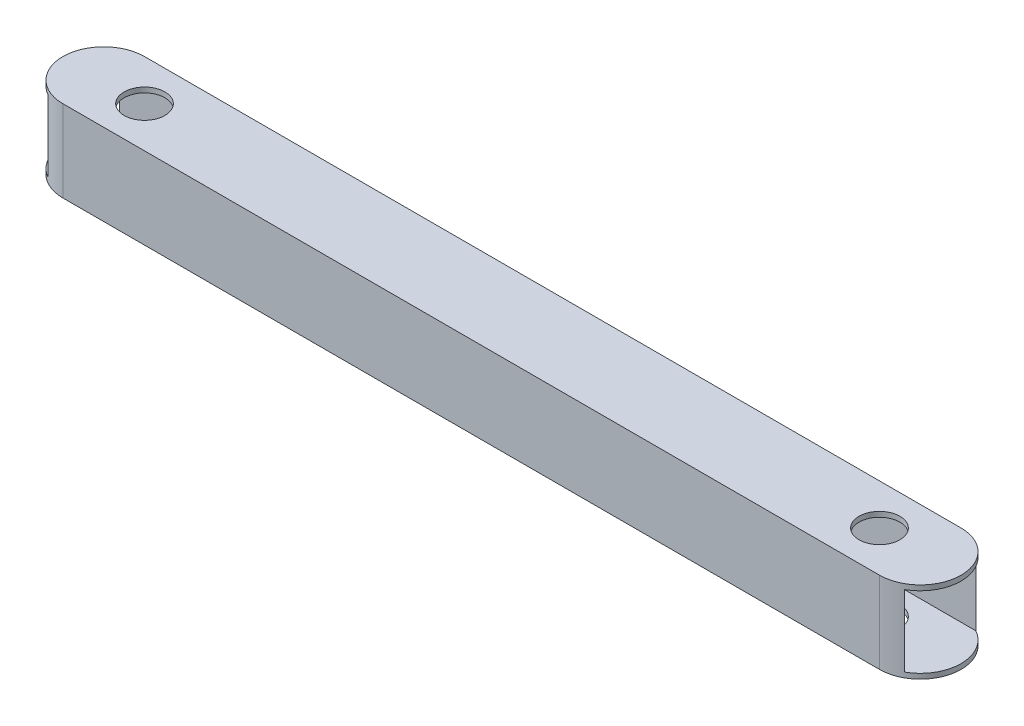
ISO-10303-21;
HEADER;
FILE_DESCRIPTION(('STEP AP214'),'2;1');
FILE_NAME('part.step','',(''),(''),'','','');
FILE_SCHEMA(('AUTOMOTIVE_DESIGN { 1 0 10303 214 1 1 1 1 }'));
ENDSEC;
DATA;
#1=APPLICATION_CONTEXT('core data for automotive mechanical design processes');
#2=APPLICATION_PROTOCOL_DEFINITION('international standard','automotive_design',2000,#1);
#3=PRODUCT_CONTEXT('',#1,'mechanical');
#4=PRODUCT('Part','Part','',(#3));
#5=PRODUCT_RELATED_PRODUCT_CATEGORY('part','',(#4));
#6=PRODUCT_DEFINITION_FORMATION('','',#4);
#7=PRODUCT_DEFINITION_CONTEXT('part definition',#1,'design');
#8=PRODUCT_DEFINITION('design','',#6,#7);
#9=PRODUCT_DEFINITION_SHAPE('','',#8);
#10=(LENGTH_UNIT() NAMED_UNIT(*) SI_UNIT(.MILLI.,.METRE.));
#11=(NAMED_UNIT(*) PLANE_ANGLE_UNIT() SI_UNIT($,.RADIAN.));
#12=(NAMED_UNIT(*) SI_UNIT($,.STERADIAN.) SOLID_ANGLE_UNIT());
#13=UNCERTAINTY_MEASURE_WITH_UNIT(LENGTH_MEASURE(1.E-05),#10,'distance_accuracy_value','');
#14=(GEOMETRIC_REPRESENTATION_CONTEXT(3) GLOBAL_UNCERTAINTY_ASSIGNED_CONTEXT((#13)) GLOBAL_UNIT_ASSIGNED_CONTEXT((#10,
#11,#12)) REPRESENTATION_CONTEXT('',''));
#15=CARTESIAN_POINT('',(0.,0.,0.));
#16=DIRECTION('',(0.,0.,1.));
#17=DIRECTION('',(1.,0.,0.));
#18=AXIS2_PLACEMENT_3D('',#15,#16,#17);
#19=CARTESIAN_POINT('',(25.4,-12.7,0.));
#20=DIRECTION('',(0.,-1.,0.));
#21=DIRECTION('',(0.,0.,-1.));
#22=AXIS2_PLACEMENT_3D('',#19,#20,#21);
#23=CYLINDRICAL_SURFACE('',#22,6.35);
#24=CARTESIAN_POINT('',(25.4,-11.1125,0.));
#25=DIRECTION('',(0.,-1.,0.));
#26=DIRECTION('',(0.,0.,-1.));
#27=AXIS2_PLACEMENT_3D('',#24,#25,#26);
#28=CIRCLE('',#27,6.35);
#29=CARTESIAN_POINT('',(25.4,-11.1125,-6.35));
#30=VERTEX_POINT('',#29);
#31=EDGE_CURVE('E115',#30,#30,#28,.T.);
#32=ORIENTED_EDGE('',*,*,#31,.F.);
#33=EDGE_LOOP('',(#32));
#34=FACE_BOUND('',#33,.T.);
#35=CARTESIAN_POINT('',(25.4,-12.7,0.));
#36=DIRECTION('',(0.,-1.,0.));
#37=DIRECTION('',(0.,0.,-1.));
#38=AXIS2_PLACEMENT_3D('',#35,#36,#37);
#39=CIRCLE('',#38,6.35);
#40=CARTESIAN_POINT('',(25.4,-12.7,-6.35));
#41=VERTEX_POINT('',#40);
#42=EDGE_CURVE('E19',#41,#41,#39,.F.);
#43=ORIENTED_EDGE('',*,*,#42,.F.);
#44=EDGE_LOOP('',(#43));
#45=FACE_BOUND('',#44,.T.);
#46=ADVANCED_FACE('F16',(#34,#45),#23,.F.);
#47=CARTESIAN_POINT('',(254.,-12.7,0.));
#48=DIRECTION('',(0.,-1.,0.));
#49=DIRECTION('',(0.,0.,-1.));
#50=AXIS2_PLACEMENT_3D('',#47,#48,#49);
#51=CYLINDRICAL_SURFACE('',#50,6.35);
#52=CARTESIAN_POINT('',(254.,-11.1125,0.));
#53=DIRECTION('',(0.,-1.,0.));
#54=DIRECTION('',(0.,0.,-1.));
#55=AXIS2_PLACEMENT_3D('',#52,#53,#54);
#56=CIRCLE('',#55,6.35);
#57=CARTESIAN_POINT('',(254.,-11.1125,-6.35));
#58=VERTEX_POINT('',#57);
#59=EDGE_CURVE('E111',#58,#58,#56,.T.);
#60=ORIENTED_EDGE('',*,*,#59,.F.);
#61=EDGE_LOOP('',(#60));
#62=FACE_BOUND('',#61,.T.);
#63=CARTESIAN_POINT('',(254.,-12.7,0.));
#64=DIRECTION('',(0.,-1.,0.));
#65=DIRECTION('',(0.,0.,-1.));
#66=AXIS2_PLACEMENT_3D('',#63,#64,#65);
#67=CIRCLE('',#66,6.35);
#68=CARTESIAN_POINT('',(254.,-12.7,-6.35));
#69=VERTEX_POINT('',#68);
#70=EDGE_CURVE('E119',#69,#69,#67,.F.);
#71=ORIENTED_EDGE('',*,*,#70,.F.);
#72=EDGE_LOOP('',(#71));
#73=FACE_BOUND('',#72,.T.);
#74=ADVANCED_FACE('F171',(#62,#73),#51,.F.);
#75=CARTESIAN_POINT('',(0.,-12.7,12.7));
#76=DIRECTION('',(0.,-1.,0.));
#77=DIRECTION('',(0.,0.,-1.));
#78=AXIS2_PLACEMENT_3D('',#75,#76,#77);
#79=PLANE('',#78);
#80=ORIENTED_EDGE('',*,*,#70,.T.);
#81=EDGE_LOOP('',(#80));
#82=FACE_BOUND('',#81,.T.);
#83=ORIENTED_EDGE('',*,*,#42,.T.);
#84=EDGE_LOOP('',(#83));
#85=FACE_BOUND('',#84,.T.);
#86=DIRECTION('',(-1.,0.,0.));
#87=VECTOR('',#86,1.);
#88=CARTESIAN_POINT('',(0.,-12.7,-12.7));
#89=LINE('',#88,#87);
#90=CARTESIAN_POINT('',(266.7,-12.7,-12.7));
#91=VERTEX_POINT('',#90);
#92=CARTESIAN_POINT('',(12.7,-12.7,-12.7));
#93=VERTEX_POINT('',#92);
#94=EDGE_CURVE('E77',#91,#93,#89,.T.);
#95=ORIENTED_EDGE('',*,*,#94,.F.);
#96=CARTESIAN_POINT('',(266.7,-12.7,0.));
#97=DIRECTION('',(0.,-1.,0.));
#98=DIRECTION('',(0.,0.,-1.));
#99=AXIS2_PLACEMENT_3D('',#96,#97,#98);
#100=CIRCLE('',#99,12.7);
#101=CARTESIAN_POINT('',(266.7,-12.7,12.7));
#102=VERTEX_POINT('',#101);
#103=EDGE_CURVE('E154',#102,#91,#100,.F.);
#104=ORIENTED_EDGE('',*,*,#103,.F.);
#105=DIRECTION('',(1.,0.,0.));
#106=VECTOR('',#105,1.);
#107=CARTESIAN_POINT('',(0.,-12.7,12.7));
#108=LINE('',#107,#106);
#109=CARTESIAN_POINT('',(12.7,-12.7,12.7));
#110=VERTEX_POINT('',#109);
#111=EDGE_CURVE('E94',#110,#102,#108,.T.);
#112=ORIENTED_EDGE('',*,*,#111,.F.);
#113=CARTESIAN_POINT('',(12.7,-12.7,0.));
#114=DIRECTION('',(0.,-1.,0.));
#115=DIRECTION('',(0.,0.,-1.));
#116=AXIS2_PLACEMENT_3D('',#113,#114,#115);
#117=CIRCLE('',#116,12.7);
#118=EDGE_CURVE('E92',#93,#110,#117,.F.);
#119=ORIENTED_EDGE('',*,*,#118,.F.);
#120=EDGE_LOOP('',(#95,#104,#112,#119));
#121=FACE_BOUND('',#120,.T.);
#122=ADVANCED_FACE('F93',(#82,#85,#121),#79,.T.);
#123=CARTESIAN_POINT('',(0.,-11.1125,11.1125));
#124=DIRECTION('',(0.,0.,-1.));
#125=DIRECTION('',(-1.,0.,0.));
#126=AXIS2_PLACEMENT_3D('',#123,#124,#125);
#127=PLANE('',#126);
#128=DIRECTION('',(1.,0.,0.));
#129=VECTOR('',#128,1.);
#130=CARTESIAN_POINT('',(0.,11.1125,11.1125));
#131=LINE('',#130,#129);
#132=CARTESIAN_POINT('',(272.848361062124,11.1125,11.112499999989));
#133=VERTEX_POINT('',#132);
#134=CARTESIAN_POINT('',(6.55163893789537,11.1125,11.1124999999998));
#135=VERTEX_POINT('',#134);
#136=EDGE_CURVE('E109',#133,#135,#131,.F.);
#137=ORIENTED_EDGE('',*,*,#136,.F.);
#138=DIRECTION('',(0.,-1.,0.));
#139=VECTOR('',#138,1.);
#140=CARTESIAN_POINT('',(272.848361062144,45.81144,11.1124999999781));
#141=LINE('',#140,#139);
#142=CARTESIAN_POINT('',(272.848361062124,-11.1125,11.112499999989));
#143=VERTEX_POINT('',#142);
#144=EDGE_CURVE('E125',#143,#133,#141,.F.);
#145=ORIENTED_EDGE('',*,*,#144,.F.);
#146=DIRECTION('',(1.,0.,0.));
#147=VECTOR('',#146,1.);
#148=CARTESIAN_POINT('',(0.,-11.1125,11.1125));
#149=LINE('',#148,#147);
#150=CARTESIAN_POINT('',(6.55163893789537,-11.1125,11.1124999999998));
#151=VERTEX_POINT('',#150);
#152=EDGE_CURVE('E112',#151,#143,#149,.T.);
#153=ORIENTED_EDGE('',*,*,#152,.F.);
#154=DIRECTION('',(0.,-1.,0.));
#155=VECTOR('',#154,1.);
#156=CARTESIAN_POINT('',(6.55163893789502,45.81144,11.1124999999996));
#157=LINE('',#156,#155);
#158=EDGE_CURVE('E129',#135,#151,#157,.T.);
#159=ORIENTED_EDGE('',*,*,#158,.F.);
#160=EDGE_LOOP('',(#137,#145,#153,#159));
#161=FACE_BOUND('',#160,.T.);
#162=ADVANCED_FACE('F218',(#161),#127,.T.);
#163=CARTESIAN_POINT('',(0.,11.1125,-11.1125));
#164=DIRECTION('',(0.,0.,1.));
#165=DIRECTION('',(1.,0.,0.));
#166=AXIS2_PLACEMENT_3D('',#163,#164,#165);
#167=PLANE('',#166);
#168=DIRECTION('',(1.,0.,0.));
#169=VECTOR('',#168,1.);
#170=CARTESIAN_POINT('',(0.,-11.1125,-11.1125));
#171=LINE('',#170,#169);
#172=CARTESIAN_POINT('',(272.848361062124,-11.1125,-11.112499999989));
#173=VERTEX_POINT('',#172);
#174=CARTESIAN_POINT('',(6.55163893789537,-11.1125,-11.1124999999998));
#175=VERTEX_POINT('',#174);
#176=EDGE_CURVE('E116',#173,#175,#171,.F.);
#177=ORIENTED_EDGE('',*,*,#176,.F.);
#178=DIRECTION('',(0.,-1.,0.));
#179=VECTOR('',#178,1.);
#180=CARTESIAN_POINT('',(272.848361062144,45.81144,-11.1124999999781));
#181=LINE('',#180,#179);
#182=CARTESIAN_POINT('',(272.848361062124,11.1125,-11.112499999989));
#183=VERTEX_POINT('',#182);
#184=EDGE_CURVE('E120',#183,#173,#181,.T.);
#185=ORIENTED_EDGE('',*,*,#184,.F.);
#186=DIRECTION('',(1.,0.,0.));
#187=VECTOR('',#186,1.);
#188=CARTESIAN_POINT('',(0.,11.1125,-11.1125));
#189=LINE('',#188,#187);
#190=CARTESIAN_POINT('',(6.55163893789537,11.1125,-11.1124999999998));
#191=VERTEX_POINT('',#190);
#192=EDGE_CURVE('E88',#191,#183,#189,.T.);
#193=ORIENTED_EDGE('',*,*,#192,.F.);
#194=DIRECTION('',(0.,-1.,0.));
#195=VECTOR('',#194,1.);
#196=CARTESIAN_POINT('',(6.55163893789502,45.81144,-11.1124999999996));
#197=LINE('',#196,#195);
#198=EDGE_CURVE('E97',#175,#191,#197,.F.);
#199=ORIENTED_EDGE('',*,*,#198,.F.);
#200=EDGE_LOOP('',(#177,#185,#193,#199));
#201=FACE_BOUND('',#200,.T.);
#202=ADVANCED_FACE('F214',(#201),#167,.T.);
#203=CARTESIAN_POINT('',(0.,-11.1125,-11.1125));
#204=DIRECTION('',(0.,1.,0.));
#205=DIRECTION('',(0.,0.,1.));
#206=AXIS2_PLACEMENT_3D('',#203,#204,#205);
#207=PLANE('',#206);
#208=ORIENTED_EDGE('',*,*,#59,.T.);
#209=EDGE_LOOP('',(#208));
#210=FACE_BOUND('',#209,.T.);
#211=ORIENTED_EDGE('',*,*,#31,.T.);
#212=EDGE_LOOP('',(#211));
#213=FACE_BOUND('',#212,.T.);
#214=ORIENTED_EDGE('',*,*,#152,.T.);
#215=CARTESIAN_POINT('',(266.7,-11.1125,0.));
#216=DIRECTION('',(0.,-1.,0.));
#217=DIRECTION('',(0.,0.,-1.));
#218=AXIS2_PLACEMENT_3D('',#215,#216,#217);
#219=CIRCLE('',#218,12.7);
#220=EDGE_CURVE('E123',#173,#143,#219,.T.);
#221=ORIENTED_EDGE('',*,*,#220,.F.);
#222=ORIENTED_EDGE('',*,*,#176,.T.);
#223=CARTESIAN_POINT('',(12.7,-11.1125,0.));
#224=DIRECTION('',(0.,-1.,0.));
#225=DIRECTION('',(0.,0.,-1.));
#226=AXIS2_PLACEMENT_3D('',#223,#224,#225);
#227=CIRCLE('',#226,12.7);
#228=EDGE_CURVE('E132',#151,#175,#227,.T.);
#229=ORIENTED_EDGE('',*,*,#228,.F.);
#230=EDGE_LOOP('',(#214,#221,#222,#229));
#231=FACE_BOUND('',#230,.T.);
#232=ADVANCED_FACE('F210',(#210,#213,#231),#207,.T.);
#233=CARTESIAN_POINT('',(0.,11.1125,11.1125));
#234=DIRECTION('',(0.,-1.,0.));
#235=DIRECTION('',(0.,0.,-1.));
#236=AXIS2_PLACEMENT_3D('',#233,#234,#235);
#237=PLANE('',#236);
#238=CARTESIAN_POINT('',(254.,11.1125,0.));
#239=DIRECTION('',(0.,-1.,0.));
#240=DIRECTION('',(0.,0.,-1.));
#241=AXIS2_PLACEMENT_3D('',#238,#239,#240);
#242=CIRCLE('',#241,6.35);
#243=CARTESIAN_POINT('',(254.,11.1125,-6.35));
#244=VERTEX_POINT('',#243);
#245=EDGE_CURVE('E144',#244,#244,#242,.F.);
#246=ORIENTED_EDGE('',*,*,#245,.T.);
#247=EDGE_LOOP('',(#246));
#248=FACE_BOUND('',#247,.T.);
#249=CARTESIAN_POINT('',(25.4,11.1125,0.));
#250=DIRECTION('',(0.,-1.,0.));
#251=DIRECTION('',(0.,0.,-1.));
#252=AXIS2_PLACEMENT_3D('',#249,#250,#251);
#253=CIRCLE('',#252,6.35);
#254=CARTESIAN_POINT('',(25.4,11.1125,-6.35));
#255=VERTEX_POINT('',#254);
#256=EDGE_CURVE('E147',#255,#255,#253,.F.);
#257=ORIENTED_EDGE('',*,*,#256,.T.);
#258=EDGE_LOOP('',(#257));
#259=FACE_BOUND('',#258,.T.);
#260=ORIENTED_EDGE('',*,*,#192,.T.);
#261=CARTESIAN_POINT('',(266.7,11.1125,0.));
#262=DIRECTION('',(0.,-1.,0.));
#263=DIRECTION('',(0.,0.,-1.));
#264=AXIS2_PLACEMENT_3D('',#261,#262,#263);
#265=CIRCLE('',#264,12.7);
#266=EDGE_CURVE('E124',#133,#183,#265,.F.);
#267=ORIENTED_EDGE('',*,*,#266,.F.);
#268=ORIENTED_EDGE('',*,*,#136,.T.);
#269=CARTESIAN_POINT('',(12.7,11.1125,0.));
#270=DIRECTION('',(0.,-1.,0.));
#271=DIRECTION('',(0.,0.,-1.));
#272=AXIS2_PLACEMENT_3D('',#269,#270,#271);
#273=CIRCLE('',#272,12.7);
#274=EDGE_CURVE('E133',#191,#135,#273,.F.);
#275=ORIENTED_EDGE('',*,*,#274,.F.);
#276=EDGE_LOOP('',(#260,#267,#268,#275));
#277=FACE_BOUND('',#276,.T.);
#278=ADVANCED_FACE('F207',(#248,#259,#277),#237,.T.);
#279=CARTESIAN_POINT('',(0.,-12.7,-12.7));
#280=DIRECTION('',(0.,0.,-1.));
#281=DIRECTION('',(-1.,0.,0.));
#282=AXIS2_PLACEMENT_3D('',#279,#280,#281);
#283=PLANE('',#282);
#284=DIRECTION('',(1.,0.,0.));
#285=VECTOR('',#284,1.);
#286=CARTESIAN_POINT('',(0.,12.7,-12.7));
#287=LINE('',#286,#285);
#288=CARTESIAN_POINT('',(266.7,12.7,-12.7));
#289=VERTEX_POINT('',#288);
#290=CARTESIAN_POINT('',(12.7,12.7,-12.7));
#291=VERTEX_POINT('',#290);
#292=EDGE_CURVE('E143',#289,#291,#287,.F.);
#293=ORIENTED_EDGE('',*,*,#292,.F.);
#294=DIRECTION('',(0.,-1.,0.));
#295=VECTOR('',#294,1.);
#296=CARTESIAN_POINT('',(266.7,45.81144,-12.7));
#297=LINE('',#296,#295);
#298=EDGE_CURVE('E84',#91,#289,#297,.F.);
#299=ORIENTED_EDGE('',*,*,#298,.F.);
#300=ORIENTED_EDGE('',*,*,#94,.T.);
#301=DIRECTION('',(0.,-1.,0.));
#302=VECTOR('',#301,1.);
#303=CARTESIAN_POINT('',(12.7,45.81144,-12.7));
#304=LINE('',#303,#302);
#305=EDGE_CURVE('E81',#291,#93,#304,.T.);
#306=ORIENTED_EDGE('',*,*,#305,.F.);
#307=EDGE_LOOP('',(#293,#299,#300,#306));
#308=FACE_BOUND('',#307,.T.);
#309=ADVANCED_FACE('F79',(#308),#283,.T.);
#310=CARTESIAN_POINT('',(12.7,45.81144,0.));
#311=DIRECTION('',(0.,-1.,0.));
#312=DIRECTION('',(0.,0.,-1.));
#313=AXIS2_PLACEMENT_3D('',#310,#311,#312);
#314=CYLINDRICAL_SURFACE('',#313,12.7);
#315=ORIENTED_EDGE('',*,*,#158,.T.);
#316=ORIENTED_EDGE('',*,*,#228,.T.);
#317=ORIENTED_EDGE('',*,*,#198,.T.);
#318=ORIENTED_EDGE('',*,*,#274,.T.);
#319=EDGE_LOOP('',(#315,#316,#317,#318));
#320=FACE_BOUND('',#319,.T.);
#321=ORIENTED_EDGE('',*,*,#118,.T.);
#322=DIRECTION('',(0.,1.,0.));
#323=VECTOR('',#322,1.);
#324=CARTESIAN_POINT('',(12.7,12.7,12.7));
#325=LINE('',#324,#323);
#326=CARTESIAN_POINT('',(12.7,12.7,12.7));
#327=VERTEX_POINT('',#326);
#328=EDGE_CURVE('E106',#327,#110,#325,.F.);
#329=ORIENTED_EDGE('',*,*,#328,.F.);
#330=CARTESIAN_POINT('',(12.7,12.7,0.));
#331=DIRECTION('',(0.,-1.,0.));
#332=DIRECTION('',(0.,0.,-1.));
#333=AXIS2_PLACEMENT_3D('',#330,#331,#332);
#334=CIRCLE('',#333,12.7);
#335=EDGE_CURVE('E101',#291,#327,#334,.F.);
#336=ORIENTED_EDGE('',*,*,#335,.F.);
#337=ORIENTED_EDGE('',*,*,#305,.T.);
#338=EDGE_LOOP('',(#321,#329,#336,#337));
#339=FACE_BOUND('',#338,.T.);
#340=ADVANCED_FACE('F99',(#320,#339),#314,.T.);
#341=CARTESIAN_POINT('',(0.,12.7,12.7));
#342=DIRECTION('',(0.,0.,1.));
#343=DIRECTION('',(1.,0.,0.));
#344=AXIS2_PLACEMENT_3D('',#341,#342,#343);
#345=PLANE('',#344);
#346=ORIENTED_EDGE('',*,*,#111,.T.);
#347=DIRECTION('',(0.,-1.,0.));
#348=VECTOR('',#347,1.);
#349=CARTESIAN_POINT('',(266.7,45.81144,12.7));
#350=LINE('',#349,#348);
#351=CARTESIAN_POINT('',(266.7,12.7,12.7));
#352=VERTEX_POINT('',#351);
#353=EDGE_CURVE('E34',#352,#102,#350,.T.);
#354=ORIENTED_EDGE('',*,*,#353,.F.);
#355=DIRECTION('',(1.,0.,0.));
#356=VECTOR('',#355,1.);
#357=CARTESIAN_POINT('',(0.,12.7,12.7));
#358=LINE('',#357,#356);
#359=EDGE_CURVE('E141',#327,#352,#358,.T.);
#360=ORIENTED_EDGE('',*,*,#359,.F.);
#361=ORIENTED_EDGE('',*,*,#328,.T.);
#362=EDGE_LOOP('',(#346,#354,#360,#361));
#363=FACE_BOUND('',#362,.T.);
#364=ADVANCED_FACE('F198',(#363),#345,.T.);
#365=CARTESIAN_POINT('',(266.7,45.81144,0.));
#366=DIRECTION('',(0.,-1.,0.));
#367=DIRECTION('',(0.,0.,-1.));
#368=AXIS2_PLACEMENT_3D('',#365,#366,#367);
#369=CYLINDRICAL_SURFACE('',#368,12.7);
#370=ORIENTED_EDGE('',*,*,#184,.T.);
#371=ORIENTED_EDGE('',*,*,#220,.T.);
#372=ORIENTED_EDGE('',*,*,#144,.T.);
#373=ORIENTED_EDGE('',*,*,#266,.T.);
#374=EDGE_LOOP('',(#370,#371,#372,#373));
#375=FACE_BOUND('',#374,.T.);
#376=ORIENTED_EDGE('',*,*,#103,.T.);
#377=ORIENTED_EDGE('',*,*,#298,.T.);
#378=CARTESIAN_POINT('',(266.7,12.7,0.));
#379=DIRECTION('',(0.,-1.,0.));
#380=DIRECTION('',(0.,0.,-1.));
#381=AXIS2_PLACEMENT_3D('',#378,#379,#380);
#382=CIRCLE('',#381,12.7);
#383=EDGE_CURVE('E138',#352,#289,#382,.F.);
#384=ORIENTED_EDGE('',*,*,#383,.F.);
#385=ORIENTED_EDGE('',*,*,#353,.T.);
#386=EDGE_LOOP('',(#376,#377,#384,#385));
#387=FACE_BOUND('',#386,.T.);
#388=ADVANCED_FACE('F194',(#375,#387),#369,.T.);
#389=CARTESIAN_POINT('',(25.4,-12.7,0.));
#390=DIRECTION('',(0.,-1.,0.));
#391=DIRECTION('',(0.,0.,-1.));
#392=AXIS2_PLACEMENT_3D('',#389,#390,#391);
#393=CYLINDRICAL_SURFACE('',#392,6.35);
#394=ORIENTED_EDGE('',*,*,#256,.F.);
#395=EDGE_LOOP('',(#394));
#396=FACE_BOUND('',#395,.T.);
#397=CARTESIAN_POINT('',(25.4,12.7,0.));
#398=DIRECTION('',(0.,-1.,0.));
#399=DIRECTION('',(0.,0.,-1.));
#400=AXIS2_PLACEMENT_3D('',#397,#398,#399);
#401=CIRCLE('',#400,6.35);
#402=CARTESIAN_POINT('',(25.4,12.7,-6.35));
#403=VERTEX_POINT('',#402);
#404=EDGE_CURVE('E25',#403,#403,#401,.T.);
#405=ORIENTED_EDGE('',*,*,#404,.F.);
#406=EDGE_LOOP('',(#405));
#407=FACE_BOUND('',#406,.T.);
#408=ADVANCED_FACE('F187',(#396,#407),#393,.F.);
#409=CARTESIAN_POINT('',(254.,-12.7,0.));
#410=DIRECTION('',(0.,-1.,0.));
#411=DIRECTION('',(0.,0.,-1.));
#412=AXIS2_PLACEMENT_3D('',#409,#410,#411);
#413=CYLINDRICAL_SURFACE('',#412,6.35);
#414=ORIENTED_EDGE('',*,*,#245,.F.);
#415=EDGE_LOOP('',(#414));
#416=FACE_BOUND('',#415,.T.);
#417=CARTESIAN_POINT('',(254.,12.7,0.));
#418=DIRECTION('',(0.,-1.,0.));
#419=DIRECTION('',(0.,0.,-1.));
#420=AXIS2_PLACEMENT_3D('',#417,#418,#419);
#421=CIRCLE('',#420,6.35);
#422=CARTESIAN_POINT('',(254.,12.7,-6.35));
#423=VERTEX_POINT('',#422);
#424=EDGE_CURVE('E11',#423,#423,#421,.T.);
#425=ORIENTED_EDGE('',*,*,#424,.F.);
#426=EDGE_LOOP('',(#425));
#427=FACE_BOUND('',#426,.T.);
#428=ADVANCED_FACE('F181',(#416,#427),#413,.F.);
#429=CARTESIAN_POINT('',(0.,12.7,-12.7));
#430=DIRECTION('',(0.,1.,0.));
#431=DIRECTION('',(0.,0.,1.));
#432=AXIS2_PLACEMENT_3D('',#429,#430,#431);
#433=PLANE('',#432);
#434=ORIENTED_EDGE('',*,*,#424,.T.);
#435=EDGE_LOOP('',(#434));
#436=FACE_BOUND('',#435,.T.);
#437=ORIENTED_EDGE('',*,*,#404,.T.);
#438=EDGE_LOOP('',(#437));
#439=FACE_BOUND('',#438,.T.);
#440=ORIENTED_EDGE('',*,*,#359,.T.);
#441=ORIENTED_EDGE('',*,*,#383,.T.);
#442=ORIENTED_EDGE('',*,*,#292,.T.);
#443=ORIENTED_EDGE('',*,*,#335,.T.);
#444=EDGE_LOOP('',(#440,#441,#442,#443));
#445=FACE_BOUND('',#444,.T.);
#446=ADVANCED_FACE('F179',(#436,#439,#445),#433,.T.);
#447=CLOSED_SHELL('',(#46,#74,#122,#162,#202,#232,#278,#309,#340,#364,#388,#408,#428,#446));
#448=MANIFOLD_SOLID_BREP('B1',#447);
#449=ADVANCED_BREP_SHAPE_REPRESENTATION('',(#18,#448),#14);
#450=SHAPE_DEFINITION_REPRESENTATION(#9,#449);
ENDSEC;
END-ISO-10303-21;
